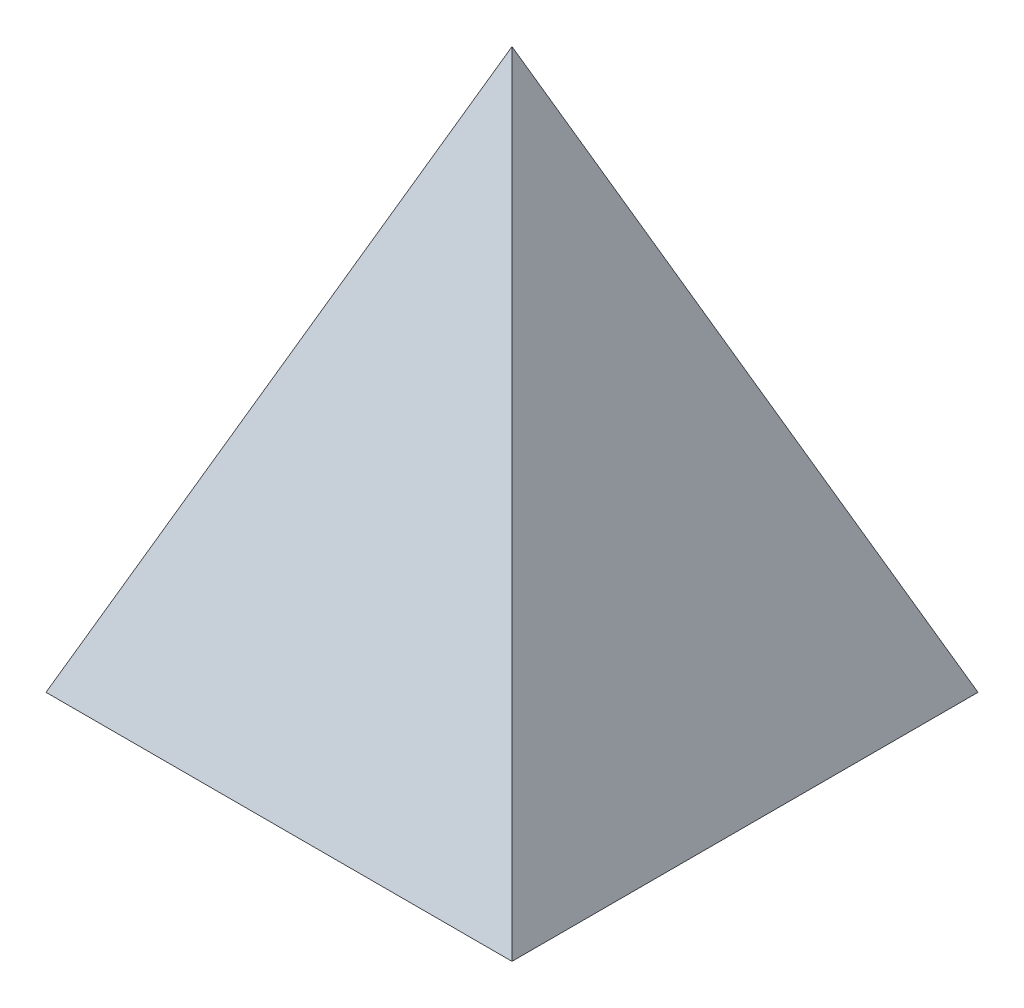
ISO-10303-21;
HEADER;
FILE_DESCRIPTION(('STEP AP214'),'2;1');
FILE_NAME('part.step','',(''),(''),'','','');
FILE_SCHEMA(('AUTOMOTIVE_DESIGN { 1 0 10303 214 1 1 1 1 }'));
ENDSEC;
DATA;
#1=APPLICATION_CONTEXT('core data for automotive mechanical design processes');
#2=APPLICATION_PROTOCOL_DEFINITION('international standard','automotive_design',2000,#1);
#3=PRODUCT_CONTEXT('',#1,'mechanical');
#4=PRODUCT('Part','Part','',(#3));
#5=PRODUCT_RELATED_PRODUCT_CATEGORY('part','',(#4));
#6=PRODUCT_DEFINITION_FORMATION('','',#4);
#7=PRODUCT_DEFINITION_CONTEXT('part definition',#1,'design');
#8=PRODUCT_DEFINITION('design','',#6,#7);
#9=PRODUCT_DEFINITION_SHAPE('','',#8);
#10=(LENGTH_UNIT() NAMED_UNIT(*) SI_UNIT(.MILLI.,.METRE.));
#11=(NAMED_UNIT(*) PLANE_ANGLE_UNIT() SI_UNIT($,.RADIAN.));
#12=(NAMED_UNIT(*) SI_UNIT($,.STERADIAN.) SOLID_ANGLE_UNIT());
#13=UNCERTAINTY_MEASURE_WITH_UNIT(LENGTH_MEASURE(1.E-05),#10,'distance_accuracy_value','');
#14=(GEOMETRIC_REPRESENTATION_CONTEXT(3) GLOBAL_UNCERTAINTY_ASSIGNED_CONTEXT((#13)) GLOBAL_UNIT_ASSIGNED_CONTEXT((#10,
#11,#12)) REPRESENTATION_CONTEXT('',''));
#15=CARTESIAN_POINT('',(0.,0.,0.));
#16=DIRECTION('',(0.,0.,1.));
#17=DIRECTION('',(1.,0.,0.));
#18=AXIS2_PLACEMENT_3D('',#15,#16,#17);
#19=CARTESIAN_POINT('',(0.,120.,50.));
#20=DIRECTION('',(0.923076923076923,-0.384615384615385,0.));
#21=DIRECTION('',(0.384615384615385,0.923076923076923,0.));
#22=AXIS2_PLACEMENT_3D('',#19,#20,#21);
#23=PLANE('',#22);
#24=DIRECTION('',(0.358979079308869,0.861549790341286,-0.358979079308869));
#25=VECTOR('',#24,1.);
#26=CARTESIAN_POINT('',(-6.44329896907217,104.536082474227,6.44329896907216));
#27=LINE('',#26,#25);
#28=CARTESIAN_POINT('',(-50.,0.,50.));
#29=VERTEX_POINT('',#28);
#30=CARTESIAN_POINT('',(0.,120.,0.));
#31=VERTEX_POINT('',#30);
#32=EDGE_CURVE('E71',#29,#31,#27,.T.);
#33=ORIENTED_EDGE('',*,*,#32,.T.);
#34=DIRECTION('',(-0.358979079308869,-0.861549790341286,-0.358979079308869));
#35=VECTOR('',#34,1.);
#36=CARTESIAN_POINT('',(6.44329896907217,135.463917525773,6.44329896907216));
#37=LINE('',#36,#35);
#38=CARTESIAN_POINT('',(-50.,0.,-50.));
#39=VERTEX_POINT('',#38);
#40=EDGE_CURVE('E80',#31,#39,#37,.T.);
#41=ORIENTED_EDGE('',*,*,#40,.T.);
#42=DIRECTION('',(0.,0.,-1.));
#43=VECTOR('',#42,1.);
#44=CARTESIAN_POINT('',(-50.,0.,50.));
#45=LINE('',#44,#43);
#46=EDGE_CURVE('E11',#29,#39,#45,.T.);
#47=ORIENTED_EDGE('',*,*,#46,.F.);
#48=EDGE_LOOP('',(#33,#41,#47));
#49=FACE_BOUND('',#48,.T.);
#50=ADVANCED_FACE('F39',(#49),#23,.F.);
#51=CARTESIAN_POINT('',(-50.,0.,50.));
#52=DIRECTION('',(0.,1.,0.));
#53=DIRECTION('',(0.,0.,1.));
#54=AXIS2_PLACEMENT_3D('',#51,#52,#53);
#55=PLANE('',#54);
#56=CARTESIAN_POINT('',(0.,0.,0.));
#57=DIRECTION('',(0.,1.,0.));
#58=DIRECTION('',(0.,0.,1.));
#59=AXIS2_PLACEMENT_3D('',#56,#57,#58);
#60=CIRCLE('',#59,4.);
#61=CARTESIAN_POINT('',(0.,0.,4.));
#62=VERTEX_POINT('',#61);
#63=EDGE_CURVE('E90',#62,#62,#60,.T.);
#64=ORIENTED_EDGE('',*,*,#63,.T.);
#65=EDGE_LOOP('',(#64));
#66=FACE_BOUND('',#65,.T.);
#67=DIRECTION('',(1.,0.,0.));
#68=VECTOR('',#67,1.);
#69=CARTESIAN_POINT('',(-50.,0.,-50.));
#70=LINE('',#69,#68);
#71=CARTESIAN_POINT('',(50.,0.,-50.));
#72=VERTEX_POINT('',#71);
#73=EDGE_CURVE('E75',#39,#72,#70,.T.);
#74=ORIENTED_EDGE('',*,*,#73,.T.);
#75=DIRECTION('',(0.,0.,-1.));
#76=VECTOR('',#75,1.);
#77=CARTESIAN_POINT('',(50.,0.,50.));
#78=LINE('',#77,#76);
#79=CARTESIAN_POINT('',(50.,0.,50.));
#80=VERTEX_POINT('',#79);
#81=EDGE_CURVE('E46',#80,#72,#78,.T.);
#82=ORIENTED_EDGE('',*,*,#81,.F.);
#83=DIRECTION('',(1.,0.,0.));
#84=VECTOR('',#83,1.);
#85=CARTESIAN_POINT('',(-50.,0.,50.));
#86=LINE('',#85,#84);
#87=EDGE_CURVE('E68',#29,#80,#86,.T.);
#88=ORIENTED_EDGE('',*,*,#87,.F.);
#89=ORIENTED_EDGE('',*,*,#46,.T.);
#90=EDGE_LOOP('',(#74,#82,#88,#89));
#91=FACE_BOUND('',#90,.T.);
#92=ADVANCED_FACE('F82',(#66,#91),#55,.F.);
#93=CARTESIAN_POINT('',(50.,0.,50.));
#94=DIRECTION('',(-0.923076923076923,-0.384615384615385,0.));
#95=DIRECTION('',(0.384615384615385,-0.923076923076923,0.));
#96=AXIS2_PLACEMENT_3D('',#93,#94,#95);
#97=PLANE('',#96);
#98=ORIENTED_EDGE('',*,*,#81,.T.);
#99=DIRECTION('',(-0.358979079308869,0.861549790341286,0.358979079308869));
#100=VECTOR('',#99,1.);
#101=CARTESIAN_POINT('',(37.1134020618557,30.9278350515464,-37.1134020618557));
#102=LINE('',#101,#100);
#103=EDGE_CURVE('E53',#72,#31,#102,.T.);
#104=ORIENTED_EDGE('',*,*,#103,.T.);
#105=DIRECTION('',(0.358979079308869,-0.861549790341286,0.358979079308869));
#106=VECTOR('',#105,1.);
#107=CARTESIAN_POINT('',(50.,0.,50.));
#108=LINE('',#107,#106);
#109=EDGE_CURVE('E61',#31,#80,#108,.T.);
#110=ORIENTED_EDGE('',*,*,#109,.T.);
#111=EDGE_LOOP('',(#98,#104,#110));
#112=FACE_BOUND('',#111,.T.);
#113=ADVANCED_FACE('F79',(#112),#97,.F.);
#114=CARTESIAN_POINT('',(-50.,120.,0.));
#115=DIRECTION('',(0.,-0.384615384615385,0.923076923076923));
#116=DIRECTION('',(0.,-0.923076923076923,-0.384615384615385));
#117=AXIS2_PLACEMENT_3D('',#114,#115,#116);
#118=PLANE('',#117);
#119=ORIENTED_EDGE('',*,*,#103,.F.);
#120=ORIENTED_EDGE('',*,*,#73,.F.);
#121=ORIENTED_EDGE('',*,*,#40,.F.);
#122=EDGE_LOOP('',(#119,#120,#121));
#123=FACE_BOUND('',#122,.T.);
#124=ADVANCED_FACE('F113',(#123),#118,.F.);
#125=CARTESIAN_POINT('',(-50.,0.,50.));
#126=DIRECTION('',(0.,-0.384615384615385,-0.923076923076923));
#127=DIRECTION('',(0.,0.923076923076923,-0.384615384615385));
#128=AXIS2_PLACEMENT_3D('',#125,#126,#127);
#129=PLANE('',#128);
#130=ORIENTED_EDGE('',*,*,#87,.T.);
#131=ORIENTED_EDGE('',*,*,#109,.F.);
#132=ORIENTED_EDGE('',*,*,#32,.F.);
#133=EDGE_LOOP('',(#130,#131,#132));
#134=FACE_BOUND('',#133,.T.);
#135=ADVANCED_FACE('F69',(#134),#129,.F.);
#136=CARTESIAN_POINT('',(0.,14.,0.));
#137=DIRECTION('',(0.,-1.,0.));
#138=DIRECTION('',(0.,0.,-1.));
#139=AXIS2_PLACEMENT_3D('',#136,#137,#138);
#140=CYLINDRICAL_SURFACE('',#139,4.);
#141=CARTESIAN_POINT('',(0.,14.,0.));
#142=DIRECTION('',(0.,1.,0.));
#143=DIRECTION('',(0.,0.,1.));
#144=AXIS2_PLACEMENT_3D('',#141,#142,#143);
#145=CIRCLE('',#144,4.);
#146=CARTESIAN_POINT('',(0.,14.,4.));
#147=VERTEX_POINT('',#146);
#148=EDGE_CURVE('E89',#147,#147,#145,.T.);
#149=ORIENTED_EDGE('',*,*,#148,.T.);
#150=EDGE_LOOP('',(#149));
#151=FACE_BOUND('',#150,.T.);
#152=ORIENTED_EDGE('',*,*,#63,.F.);
#153=EDGE_LOOP('',(#152));
#154=FACE_BOUND('',#153,.T.);
#155=ADVANCED_FACE('F96',(#151,#154),#140,.F.);
#156=CARTESIAN_POINT('',(0.,14.,0.));
#157=DIRECTION('',(0.,1.,0.));
#158=DIRECTION('',(0.,0.,1.));
#159=AXIS2_PLACEMENT_3D('',#156,#157,#158);
#160=PLANE('',#159);
#161=ORIENTED_EDGE('',*,*,#148,.F.);
#162=EDGE_LOOP('',(#161));
#163=FACE_BOUND('',#162,.T.);
#164=ADVANCED_FACE('F99',(#163),#160,.F.);
#165=CLOSED_SHELL('',(#50,#92,#113,#124,#135,#155,#164));
#166=MANIFOLD_SOLID_BREP('B2',#165);
#167=ADVANCED_BREP_SHAPE_REPRESENTATION('',(#18,#166),#14);
#168=SHAPE_DEFINITION_REPRESENTATION(#9,#167);
ENDSEC;
END-ISO-10303-21;
